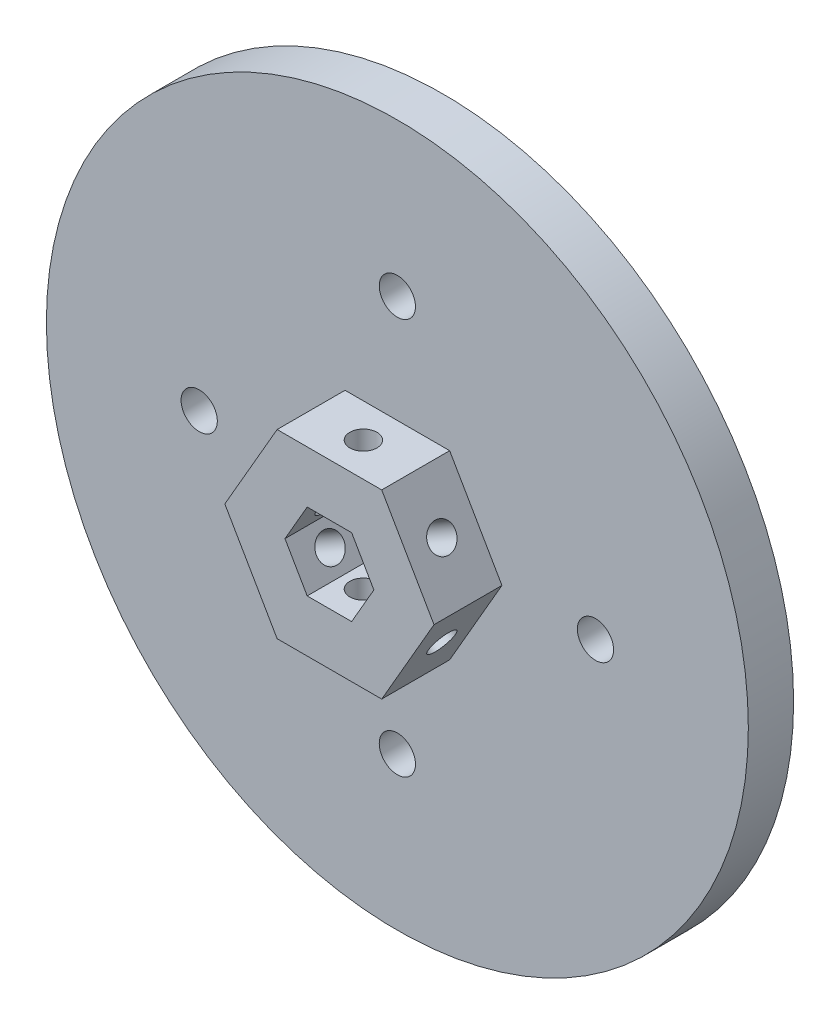
ISO-10303-21;
HEADER;
FILE_DESCRIPTION(('STEP AP214'),'2;1');
FILE_NAME('part.step','',(''),(''),'','','');
FILE_SCHEMA(('AUTOMOTIVE_DESIGN { 1 0 10303 214 1 1 1 1 }'));
ENDSEC;
DATA;
#1=APPLICATION_CONTEXT('core data for automotive mechanical design processes');
#2=APPLICATION_PROTOCOL_DEFINITION('international standard','automotive_design',2000,#1);
#3=PRODUCT_CONTEXT('',#1,'mechanical');
#4=PRODUCT('Part','Part','',(#3));
#5=PRODUCT_RELATED_PRODUCT_CATEGORY('part','',(#4));
#6=PRODUCT_DEFINITION_FORMATION('','',#4);
#7=PRODUCT_DEFINITION_CONTEXT('part definition',#1,'design');
#8=PRODUCT_DEFINITION('design','',#6,#7);
#9=PRODUCT_DEFINITION_SHAPE('','',#8);
#10=(LENGTH_UNIT() NAMED_UNIT(*) SI_UNIT(.MILLI.,.METRE.));
#11=(NAMED_UNIT(*) PLANE_ANGLE_UNIT() SI_UNIT($,.RADIAN.));
#12=(NAMED_UNIT(*) SI_UNIT($,.STERADIAN.) SOLID_ANGLE_UNIT());
#13=UNCERTAINTY_MEASURE_WITH_UNIT(LENGTH_MEASURE(1.E-05),#10,'distance_accuracy_value','');
#14=(GEOMETRIC_REPRESENTATION_CONTEXT(3) GLOBAL_UNCERTAINTY_ASSIGNED_CONTEXT((#13)) GLOBAL_UNIT_ASSIGNED_CONTEXT((#10,
#11,#12)) REPRESENTATION_CONTEXT('',''));
#15=CARTESIAN_POINT('',(0.,0.,0.));
#16=DIRECTION('',(0.,0.,1.));
#17=DIRECTION('',(1.,0.,0.));
#18=AXIS2_PLACEMENT_3D('',#15,#16,#17);
#19=CARTESIAN_POINT('',(0.,0.,4.));
#20=DIRECTION('',(0.,0.,1.));
#21=DIRECTION('',(1.,0.,0.));
#22=AXIS2_PLACEMENT_3D('',#19,#20,#21);
#23=PLANE('',#22);
#24=CARTESIAN_POINT('',(-17.5,0.,4.));
#25=DIRECTION('',(0.,0.,1.));
#26=DIRECTION('',(-1.,0.,0.));
#27=AXIS2_PLACEMENT_3D('',#24,#25,#26);
#28=CIRCLE('',#27,1.6);
#29=CARTESIAN_POINT('',(-19.1,0.,4.));
#30=VERTEX_POINT('',#29);
#31=EDGE_CURVE('E157',#30,#30,#28,.T.);
#32=ORIENTED_EDGE('',*,*,#31,.F.);
#33=EDGE_LOOP('',(#32));
#34=FACE_BOUND('',#33,.T.);
#35=CARTESIAN_POINT('',(0.,-17.5,4.));
#36=DIRECTION('',(0.,0.,1.));
#37=DIRECTION('',(-1.,0.,0.));
#38=AXIS2_PLACEMENT_3D('',#35,#36,#37);
#39=CIRCLE('',#38,1.6);
#40=CARTESIAN_POINT('',(-1.6,-17.5,4.));
#41=VERTEX_POINT('',#40);
#42=EDGE_CURVE('E160',#41,#41,#39,.T.);
#43=ORIENTED_EDGE('',*,*,#42,.F.);
#44=EDGE_LOOP('',(#43));
#45=FACE_BOUND('',#44,.T.);
#46=CARTESIAN_POINT('',(17.5,0.,4.));
#47=DIRECTION('',(0.,0.,1.));
#48=DIRECTION('',(1.,0.,0.));
#49=AXIS2_PLACEMENT_3D('',#46,#47,#48);
#50=CIRCLE('',#49,1.6);
#51=CARTESIAN_POINT('',(19.1,0.,4.));
#52=VERTEX_POINT('',#51);
#53=EDGE_CURVE('E164',#52,#52,#50,.T.);
#54=ORIENTED_EDGE('',*,*,#53,.F.);
#55=EDGE_LOOP('',(#54));
#56=FACE_BOUND('',#55,.T.);
#57=CARTESIAN_POINT('',(0.,17.5,4.));
#58=DIRECTION('',(0.,0.,1.));
#59=DIRECTION('',(1.,0.,0.));
#60=AXIS2_PLACEMENT_3D('',#57,#58,#59);
#61=CIRCLE('',#60,1.6);
#62=CARTESIAN_POINT('',(1.6,17.5,4.));
#63=VERTEX_POINT('',#62);
#64=EDGE_CURVE('E168',#63,#63,#61,.T.);
#65=ORIENTED_EDGE('',*,*,#64,.F.);
#66=EDGE_LOOP('',(#65));
#67=FACE_BOUND('',#66,.T.);
#68=CARTESIAN_POINT('',(0.,0.,4.));
#69=DIRECTION('',(0.,0.,1.));
#70=DIRECTION('',(1.,0.,0.));
#71=AXIS2_PLACEMENT_3D('',#68,#69,#70);
#72=CIRCLE('',#71,31.);
#73=CARTESIAN_POINT('',(31.,0.,4.));
#74=VERTEX_POINT('',#73);
#75=EDGE_CURVE('E11',#74,#74,#72,.T.);
#76=ORIENTED_EDGE('',*,*,#75,.T.);
#77=EDGE_LOOP('',(#76));
#78=FACE_BOUND('',#77,.T.);
#79=DIRECTION('',(-1.,0.,0.));
#80=VECTOR('',#79,1.);
#81=CARTESIAN_POINT('',(4.618802153517,8.,4.));
#82=LINE('',#81,#80);
#83=CARTESIAN_POINT('',(4.618802153517,8.,4.));
#84=VERTEX_POINT('',#83);
#85=CARTESIAN_POINT('',(-4.61880215351701,8.,4.));
#86=VERTEX_POINT('',#85);
#87=EDGE_CURVE('E235',#84,#86,#82,.T.);
#88=ORIENTED_EDGE('',*,*,#87,.F.);
#89=DIRECTION('',(-0.5,0.866025403784439,0.));
#90=VECTOR('',#89,1.);
#91=CARTESIAN_POINT('',(9.23760430703401,0.,4.));
#92=LINE('',#91,#90);
#93=CARTESIAN_POINT('',(9.23760430703401,0.,4.));
#94=VERTEX_POINT('',#93);
#95=EDGE_CURVE('E217',#94,#84,#92,.T.);
#96=ORIENTED_EDGE('',*,*,#95,.F.);
#97=DIRECTION('',(0.5,0.866025403784439,0.));
#98=VECTOR('',#97,1.);
#99=CARTESIAN_POINT('',(4.618802153517,-8.,4.));
#100=LINE('',#99,#98);
#101=CARTESIAN_POINT('',(4.618802153517,-8.,4.));
#102=VERTEX_POINT('',#101);
#103=EDGE_CURVE('E222',#102,#94,#100,.T.);
#104=ORIENTED_EDGE('',*,*,#103,.F.);
#105=DIRECTION('',(1.,0.,0.));
#106=VECTOR('',#105,1.);
#107=CARTESIAN_POINT('',(-4.61880215351701,-8.,4.));
#108=LINE('',#107,#106);
#109=CARTESIAN_POINT('',(-4.61880215351701,-8.,4.));
#110=VERTEX_POINT('',#109);
#111=EDGE_CURVE('E241',#110,#102,#108,.T.);
#112=ORIENTED_EDGE('',*,*,#111,.F.);
#113=DIRECTION('',(0.5,-0.866025403784439,0.));
#114=VECTOR('',#113,1.);
#115=CARTESIAN_POINT('',(-9.23760430703401,0.,4.));
#116=LINE('',#115,#114);
#117=CARTESIAN_POINT('',(-9.23760430703401,0.,4.));
#118=VERTEX_POINT('',#117);
#119=EDGE_CURVE('E239',#118,#110,#116,.T.);
#120=ORIENTED_EDGE('',*,*,#119,.F.);
#121=DIRECTION('',(-0.5,-0.866025403784439,0.));
#122=VECTOR('',#121,1.);
#123=CARTESIAN_POINT('',(-4.61880215351701,8.,4.));
#124=LINE('',#123,#122);
#125=EDGE_CURVE('E237',#86,#118,#124,.T.);
#126=ORIENTED_EDGE('',*,*,#125,.F.);
#127=EDGE_LOOP('',(#88,#96,#104,#112,#120,#126));
#128=FACE_BOUND('',#127,.T.);
#129=ADVANCED_FACE('F33',(#34,#45,#56,#67,#78,#128),#23,.T.);
#130=CARTESIAN_POINT('',(0.,0.,4.));
#131=DIRECTION('',(0.,0.,-1.));
#132=DIRECTION('',(-1.,0.,0.));
#133=AXIS2_PLACEMENT_3D('',#130,#131,#132);
#134=CYLINDRICAL_SURFACE('',#133,31.);
#135=ORIENTED_EDGE('',*,*,#75,.F.);
#136=EDGE_LOOP('',(#135));
#137=FACE_BOUND('',#136,.T.);
#138=CARTESIAN_POINT('',(0.,0.,0.));
#139=DIRECTION('',(0.,0.,1.));
#140=DIRECTION('',(1.,0.,0.));
#141=AXIS2_PLACEMENT_3D('',#138,#139,#140);
#142=CIRCLE('',#141,31.);
#143=CARTESIAN_POINT('',(31.,0.,0.));
#144=VERTEX_POINT('',#143);
#145=EDGE_CURVE('E42',#144,#144,#142,.T.);
#146=ORIENTED_EDGE('',*,*,#145,.T.);
#147=EDGE_LOOP('',(#146));
#148=FACE_BOUND('',#147,.T.);
#149=ADVANCED_FACE('F35',(#137,#148),#134,.T.);
#150=CARTESIAN_POINT('',(0.,0.,0.));
#151=DIRECTION('',(0.,0.,1.));
#152=DIRECTION('',(1.,0.,0.));
#153=AXIS2_PLACEMENT_3D('',#150,#151,#152);
#154=PLANE('',#153);
#155=DIRECTION('',(1.,0.,0.));
#156=VECTOR('',#155,1.);
#157=CARTESIAN_POINT('',(-1.96299091524473,-3.4,0.));
#158=LINE('',#157,#156);
#159=CARTESIAN_POINT('',(-1.96299091524473,-3.4,0.));
#160=VERTEX_POINT('',#159);
#161=CARTESIAN_POINT('',(1.96299091524473,-3.4,0.));
#162=VERTEX_POINT('',#161);
#163=EDGE_CURVE('E147',#160,#162,#158,.T.);
#164=ORIENTED_EDGE('',*,*,#163,.T.);
#165=DIRECTION('',(0.5,0.866025403784438,0.));
#166=VECTOR('',#165,1.);
#167=CARTESIAN_POINT('',(1.96299091524473,-3.4,0.));
#168=LINE('',#167,#166);
#169=CARTESIAN_POINT('',(3.92598183048946,0.,0.));
#170=VERTEX_POINT('',#169);
#171=EDGE_CURVE('E129',#162,#170,#168,.T.);
#172=ORIENTED_EDGE('',*,*,#171,.T.);
#173=DIRECTION('',(-0.5,0.866025403784438,0.));
#174=VECTOR('',#173,1.);
#175=CARTESIAN_POINT('',(3.92598183048946,0.,0.));
#176=LINE('',#175,#174);
#177=CARTESIAN_POINT('',(1.96299091524473,3.4,0.));
#178=VERTEX_POINT('',#177);
#179=EDGE_CURVE('E137',#170,#178,#176,.T.);
#180=ORIENTED_EDGE('',*,*,#179,.T.);
#181=DIRECTION('',(-1.,0.,0.));
#182=VECTOR('',#181,1.);
#183=CARTESIAN_POINT('',(1.96299091524473,3.4,0.));
#184=LINE('',#183,#182);
#185=CARTESIAN_POINT('',(-1.96299091524473,3.4,0.));
#186=VERTEX_POINT('',#185);
#187=EDGE_CURVE('E141',#178,#186,#184,.T.);
#188=ORIENTED_EDGE('',*,*,#187,.T.);
#189=DIRECTION('',(-0.5,-0.866025403784439,0.));
#190=VECTOR('',#189,1.);
#191=CARTESIAN_POINT('',(-1.96299091524473,3.4,0.));
#192=LINE('',#191,#190);
#193=CARTESIAN_POINT('',(-3.92598183048946,0.,0.));
#194=VERTEX_POINT('',#193);
#195=EDGE_CURVE('E151',#186,#194,#192,.T.);
#196=ORIENTED_EDGE('',*,*,#195,.T.);
#197=DIRECTION('',(0.5,-0.866025403784438,0.));
#198=VECTOR('',#197,1.);
#199=CARTESIAN_POINT('',(-3.92598183048946,0.,0.));
#200=LINE('',#199,#198);
#201=EDGE_CURVE('E154',#194,#160,#200,.T.);
#202=ORIENTED_EDGE('',*,*,#201,.T.);
#203=EDGE_LOOP('',(#164,#172,#180,#188,#196,#202));
#204=FACE_BOUND('',#203,.T.);
#205=CARTESIAN_POINT('',(-17.5,0.,0.));
#206=DIRECTION('',(0.,0.,1.));
#207=DIRECTION('',(1.,0.,0.));
#208=AXIS2_PLACEMENT_3D('',#205,#206,#207);
#209=CIRCLE('',#208,1.6);
#210=CARTESIAN_POINT('',(-15.9,0.,0.));
#211=VERTEX_POINT('',#210);
#212=EDGE_CURVE('E37',#211,#211,#209,.T.);
#213=ORIENTED_EDGE('',*,*,#212,.T.);
#214=EDGE_LOOP('',(#213));
#215=FACE_BOUND('',#214,.T.);
#216=CARTESIAN_POINT('',(0.,-17.5,0.));
#217=DIRECTION('',(0.,0.,1.));
#218=DIRECTION('',(1.,0.,0.));
#219=AXIS2_PLACEMENT_3D('',#216,#217,#218);
#220=CIRCLE('',#219,1.6);
#221=CARTESIAN_POINT('',(1.6,-17.5,0.));
#222=VERTEX_POINT('',#221);
#223=EDGE_CURVE('E163',#222,#222,#220,.T.);
#224=ORIENTED_EDGE('',*,*,#223,.T.);
#225=EDGE_LOOP('',(#224));
#226=FACE_BOUND('',#225,.T.);
#227=CARTESIAN_POINT('',(17.5,0.,0.));
#228=DIRECTION('',(0.,0.,1.));
#229=DIRECTION('',(1.,0.,0.));
#230=AXIS2_PLACEMENT_3D('',#227,#228,#229);
#231=CIRCLE('',#230,1.6);
#232=CARTESIAN_POINT('',(19.1,0.,0.));
#233=VERTEX_POINT('',#232);
#234=EDGE_CURVE('E167',#233,#233,#231,.T.);
#235=ORIENTED_EDGE('',*,*,#234,.T.);
#236=EDGE_LOOP('',(#235));
#237=FACE_BOUND('',#236,.T.);
#238=CARTESIAN_POINT('',(0.,17.5,0.));
#239=DIRECTION('',(0.,0.,1.));
#240=DIRECTION('',(1.,0.,0.));
#241=AXIS2_PLACEMENT_3D('',#238,#239,#240);
#242=CIRCLE('',#241,1.6);
#243=CARTESIAN_POINT('',(1.6,17.5,0.));
#244=VERTEX_POINT('',#243);
#245=EDGE_CURVE('E171',#244,#244,#242,.T.);
#246=ORIENTED_EDGE('',*,*,#245,.T.);
#247=EDGE_LOOP('',(#246));
#248=FACE_BOUND('',#247,.T.);
#249=ORIENTED_EDGE('',*,*,#145,.F.);
#250=EDGE_LOOP('',(#249));
#251=FACE_BOUND('',#250,.T.);
#252=ADVANCED_FACE('F143',(#204,#215,#226,#237,#248,#251),#154,.F.);
#253=CARTESIAN_POINT('',(0.,0.,10.));
#254=DIRECTION('',(0.,0.,1.));
#255=DIRECTION('',(1.,0.,0.));
#256=AXIS2_PLACEMENT_3D('',#253,#254,#255);
#257=PLANE('',#256);
#258=DIRECTION('',(-0.5,0.866025403784439,0.));
#259=VECTOR('',#258,1.);
#260=CARTESIAN_POINT('',(9.23760430703401,0.,10.));
#261=LINE('',#260,#259);
#262=CARTESIAN_POINT('',(9.23760430703401,0.,10.));
#263=VERTEX_POINT('',#262);
#264=CARTESIAN_POINT('',(4.618802153517,8.,10.));
#265=VERTEX_POINT('',#264);
#266=EDGE_CURVE('E218',#263,#265,#261,.T.);
#267=ORIENTED_EDGE('',*,*,#266,.T.);
#268=DIRECTION('',(-1.,0.,0.));
#269=VECTOR('',#268,1.);
#270=CARTESIAN_POINT('',(4.618802153517,8.,10.));
#271=LINE('',#270,#269);
#272=CARTESIAN_POINT('',(-4.61880215351701,8.,10.));
#273=VERTEX_POINT('',#272);
#274=EDGE_CURVE('E221',#265,#273,#271,.T.);
#275=ORIENTED_EDGE('',*,*,#274,.T.);
#276=DIRECTION('',(-0.5,-0.866025403784439,0.));
#277=VECTOR('',#276,1.);
#278=CARTESIAN_POINT('',(-4.61880215351701,8.,10.));
#279=LINE('',#278,#277);
#280=CARTESIAN_POINT('',(-9.23760430703401,0.,10.));
#281=VERTEX_POINT('',#280);
#282=EDGE_CURVE('E224',#273,#281,#279,.T.);
#283=ORIENTED_EDGE('',*,*,#282,.T.);
#284=DIRECTION('',(0.5,-0.866025403784439,0.));
#285=VECTOR('',#284,1.);
#286=CARTESIAN_POINT('',(-9.23760430703401,0.,10.));
#287=LINE('',#286,#285);
#288=CARTESIAN_POINT('',(-4.61880215351701,-8.,10.));
#289=VERTEX_POINT('',#288);
#290=EDGE_CURVE('E226',#281,#289,#287,.T.);
#291=ORIENTED_EDGE('',*,*,#290,.T.);
#292=DIRECTION('',(1.,0.,0.));
#293=VECTOR('',#292,1.);
#294=CARTESIAN_POINT('',(-4.61880215351701,-8.,10.));
#295=LINE('',#294,#293);
#296=CARTESIAN_POINT('',(4.618802153517,-8.,10.));
#297=VERTEX_POINT('',#296);
#298=EDGE_CURVE('E228',#289,#297,#295,.T.);
#299=ORIENTED_EDGE('',*,*,#298,.T.);
#300=DIRECTION('',(0.5,0.866025403784439,0.));
#301=VECTOR('',#300,1.);
#302=CARTESIAN_POINT('',(4.618802153517,-8.,10.));
#303=LINE('',#302,#301);
#304=EDGE_CURVE('E230',#297,#263,#303,.T.);
#305=ORIENTED_EDGE('',*,*,#304,.T.);
#306=EDGE_LOOP('',(#267,#275,#283,#291,#299,#305));
#307=FACE_BOUND('',#306,.T.);
#308=DIRECTION('',(-1.,0.,0.));
#309=VECTOR('',#308,1.);
#310=CARTESIAN_POINT('',(1.96299091524473,3.4,10.));
#311=LINE('',#310,#309);
#312=CARTESIAN_POINT('',(1.96299091524473,3.4,10.));
#313=VERTEX_POINT('',#312);
#314=CARTESIAN_POINT('',(-1.96299091524473,3.4,10.));
#315=VERTEX_POINT('',#314);
#316=EDGE_CURVE('E199',#313,#315,#311,.T.);
#317=ORIENTED_EDGE('',*,*,#316,.F.);
#318=DIRECTION('',(-0.5,0.866025403784439,0.));
#319=VECTOR('',#318,1.);
#320=CARTESIAN_POINT('',(3.92598183048946,0.,10.));
#321=LINE('',#320,#319);
#322=CARTESIAN_POINT('',(3.92598183048946,0.,10.));
#323=VERTEX_POINT('',#322);
#324=EDGE_CURVE('E197',#323,#313,#321,.T.);
#325=ORIENTED_EDGE('',*,*,#324,.F.);
#326=DIRECTION('',(0.5,0.866025403784439,0.));
#327=VECTOR('',#326,1.);
#328=CARTESIAN_POINT('',(1.96299091524473,-3.4,10.));
#329=LINE('',#328,#327);
#330=CARTESIAN_POINT('',(1.96299091524473,-3.4,10.));
#331=VERTEX_POINT('',#330);
#332=EDGE_CURVE('E132',#331,#323,#329,.T.);
#333=ORIENTED_EDGE('',*,*,#332,.F.);
#334=DIRECTION('',(1.,0.,0.));
#335=VECTOR('',#334,1.);
#336=CARTESIAN_POINT('',(-1.96299091524473,-3.4,10.));
#337=LINE('',#336,#335);
#338=CARTESIAN_POINT('',(-1.96299091524473,-3.4,10.));
#339=VERTEX_POINT('',#338);
#340=EDGE_CURVE('E205',#339,#331,#337,.T.);
#341=ORIENTED_EDGE('',*,*,#340,.F.);
#342=DIRECTION('',(0.5,-0.866025403784438,0.));
#343=VECTOR('',#342,1.);
#344=CARTESIAN_POINT('',(-3.92598183048946,0.,10.));
#345=LINE('',#344,#343);
#346=CARTESIAN_POINT('',(-3.92598183048946,0.,10.));
#347=VERTEX_POINT('',#346);
#348=EDGE_CURVE('E203',#347,#339,#345,.T.);
#349=ORIENTED_EDGE('',*,*,#348,.F.);
#350=DIRECTION('',(-0.5,-0.866025403784439,0.));
#351=VECTOR('',#350,1.);
#352=CARTESIAN_POINT('',(-1.96299091524473,3.4,10.));
#353=LINE('',#352,#351);
#354=EDGE_CURVE('E201',#315,#347,#353,.T.);
#355=ORIENTED_EDGE('',*,*,#354,.F.);
#356=EDGE_LOOP('',(#317,#325,#333,#341,#349,#355));
#357=FACE_BOUND('',#356,.T.);
#358=ADVANCED_FACE('F307',(#307,#357),#257,.T.);
#359=CARTESIAN_POINT('',(9.23760430703401,0.,10.));
#360=DIRECTION('',(-0.866025403784438,-0.5,0.));
#361=DIRECTION('',(0.5,-0.866025403784439,0.));
#362=AXIS2_PLACEMENT_3D('',#359,#360,#361);
#363=PLANE('',#362);
#364=CARTESIAN_POINT('',(6.92820323027548,4.00000000000003,7.));
#365=DIRECTION('',(-0.866025403784438,-0.5,0.));
#366=DIRECTION('',(0.5,-0.866025403784439,0.));
#367=AXIS2_PLACEMENT_3D('',#364,#365,#366);
#368=CIRCLE('',#367,1.2);
#369=CARTESIAN_POINT('',(7.52820323027548,2.96076951545871,7.));
#370=VERTEX_POINT('',#369);
#371=EDGE_CURVE('E184',#370,#370,#368,.T.);
#372=ORIENTED_EDGE('',*,*,#371,.T.);
#373=EDGE_LOOP('',(#372));
#374=FACE_BOUND('',#373,.T.);
#375=ORIENTED_EDGE('',*,*,#95,.T.);
#376=DIRECTION('',(0.,0.,-1.));
#377=VECTOR('',#376,1.);
#378=CARTESIAN_POINT('',(4.618802153517,8.,10.));
#379=LINE('',#378,#377);
#380=EDGE_CURVE('E256',#265,#84,#379,.T.);
#381=ORIENTED_EDGE('',*,*,#380,.F.);
#382=ORIENTED_EDGE('',*,*,#266,.F.);
#383=DIRECTION('',(0.,0.,-1.));
#384=VECTOR('',#383,1.);
#385=CARTESIAN_POINT('',(9.23760430703401,0.,10.));
#386=LINE('',#385,#384);
#387=EDGE_CURVE('E232',#263,#94,#386,.T.);
#388=ORIENTED_EDGE('',*,*,#387,.T.);
#389=EDGE_LOOP('',(#375,#381,#382,#388));
#390=FACE_BOUND('',#389,.T.);
#391=ADVANCED_FACE('F304',(#374,#390),#363,.F.);
#392=CARTESIAN_POINT('',(4.618802153517,8.,10.));
#393=DIRECTION('',(0.,-1.,0.));
#394=DIRECTION('',(1.,0.,0.));
#395=AXIS2_PLACEMENT_3D('',#392,#393,#394);
#396=PLANE('',#395);
#397=CARTESIAN_POINT('',(0.,8.,7.));
#398=DIRECTION('',(0.,1.,0.));
#399=DIRECTION('',(-1.,0.,0.));
#400=AXIS2_PLACEMENT_3D('',#397,#398,#399);
#401=CIRCLE('',#400,1.2);
#402=CARTESIAN_POINT('',(-1.2,8.,7.));
#403=VERTEX_POINT('',#402);
#404=EDGE_CURVE('E187',#403,#403,#401,.T.);
#405=ORIENTED_EDGE('',*,*,#404,.F.);
#406=EDGE_LOOP('',(#405));
#407=FACE_BOUND('',#406,.T.);
#408=ORIENTED_EDGE('',*,*,#87,.T.);
#409=DIRECTION('',(0.,0.,-1.));
#410=VECTOR('',#409,1.);
#411=CARTESIAN_POINT('',(-4.61880215351701,8.,10.));
#412=LINE('',#411,#410);
#413=EDGE_CURVE('E253',#273,#86,#412,.T.);
#414=ORIENTED_EDGE('',*,*,#413,.F.);
#415=ORIENTED_EDGE('',*,*,#274,.F.);
#416=ORIENTED_EDGE('',*,*,#380,.T.);
#417=EDGE_LOOP('',(#408,#414,#415,#416));
#418=FACE_BOUND('',#417,.T.);
#419=ADVANCED_FACE('F316',(#407,#418),#396,.F.);
#420=CARTESIAN_POINT('',(-4.61880215351701,8.,10.));
#421=DIRECTION('',(0.866025403784439,-0.5,0.));
#422=DIRECTION('',(0.5,0.866025403784439,0.));
#423=AXIS2_PLACEMENT_3D('',#420,#421,#422);
#424=PLANE('',#423);
#425=CARTESIAN_POINT('',(-6.92820323027555,3.99999999999993,7.));
#426=DIRECTION('',(0.866025403784439,-0.5,0.));
#427=DIRECTION('',(0.5,0.866025403784439,0.));
#428=AXIS2_PLACEMENT_3D('',#425,#426,#427);
#429=CIRCLE('',#428,1.2);
#430=CARTESIAN_POINT('',(-6.32820323027555,5.03923048454126,7.));
#431=VERTEX_POINT('',#430);
#432=EDGE_CURVE('E179',#431,#431,#429,.T.);
#433=ORIENTED_EDGE('',*,*,#432,.T.);
#434=EDGE_LOOP('',(#433));
#435=FACE_BOUND('',#434,.T.);
#436=ORIENTED_EDGE('',*,*,#125,.T.);
#437=DIRECTION('',(0.,0.,-1.));
#438=VECTOR('',#437,1.);
#439=CARTESIAN_POINT('',(-9.23760430703401,0.,10.));
#440=LINE('',#439,#438);
#441=EDGE_CURVE('E250',#281,#118,#440,.T.);
#442=ORIENTED_EDGE('',*,*,#441,.F.);
#443=ORIENTED_EDGE('',*,*,#282,.F.);
#444=ORIENTED_EDGE('',*,*,#413,.T.);
#445=EDGE_LOOP('',(#436,#442,#443,#444));
#446=FACE_BOUND('',#445,.T.);
#447=ADVANCED_FACE('F333',(#435,#446),#424,.F.);
#448=CARTESIAN_POINT('',(-9.23760430703401,0.,10.));
#449=DIRECTION('',(0.866025403784438,0.5,0.));
#450=DIRECTION('',(-0.5,0.866025403784439,0.));
#451=AXIS2_PLACEMENT_3D('',#448,#449,#450);
#452=PLANE('',#451);
#453=CARTESIAN_POINT('',(-6.92820323027549,-4.00000000000003,7.));
#454=DIRECTION('',(-0.866025403784436,-0.500000000000004,0.));
#455=DIRECTION('',(0.500000000000004,-0.866025403784436,0.));
#456=AXIS2_PLACEMENT_3D('',#453,#454,#455);
#457=CIRCLE('',#456,1.2);
#458=CARTESIAN_POINT('',(-6.32820323027548,-5.03923048454136,7.));
#459=VERTEX_POINT('',#458);
#460=EDGE_CURVE('E175',#459,#459,#457,.T.);
#461=ORIENTED_EDGE('',*,*,#460,.F.);
#462=EDGE_LOOP('',(#461));
#463=FACE_BOUND('',#462,.T.);
#464=ORIENTED_EDGE('',*,*,#119,.T.);
#465=DIRECTION('',(0.,0.,-1.));
#466=VECTOR('',#465,1.);
#467=CARTESIAN_POINT('',(-4.61880215351701,-8.,10.));
#468=LINE('',#467,#466);
#469=EDGE_CURVE('E247',#289,#110,#468,.T.);
#470=ORIENTED_EDGE('',*,*,#469,.F.);
#471=ORIENTED_EDGE('',*,*,#290,.F.);
#472=ORIENTED_EDGE('',*,*,#441,.T.);
#473=EDGE_LOOP('',(#464,#470,#471,#472));
#474=FACE_BOUND('',#473,.T.);
#475=ADVANCED_FACE('F329',(#463,#474),#452,.F.);
#476=CARTESIAN_POINT('',(-4.61880215351701,-8.,10.));
#477=DIRECTION('',(0.,1.,0.));
#478=DIRECTION('',(-1.,0.,0.));
#479=AXIS2_PLACEMENT_3D('',#476,#477,#478);
#480=PLANE('',#479);
#481=CARTESIAN_POINT('',(0.,-8.,7.));
#482=DIRECTION('',(0.,1.,0.));
#483=DIRECTION('',(-1.,0.,0.));
#484=AXIS2_PLACEMENT_3D('',#481,#482,#483);
#485=CIRCLE('',#484,1.2);
#486=CARTESIAN_POINT('',(-1.2,-8.,7.));
#487=VERTEX_POINT('',#486);
#488=EDGE_CURVE('E194',#487,#487,#485,.T.);
#489=ORIENTED_EDGE('',*,*,#488,.T.);
#490=EDGE_LOOP('',(#489));
#491=FACE_BOUND('',#490,.T.);
#492=ORIENTED_EDGE('',*,*,#111,.T.);
#493=DIRECTION('',(0.,0.,-1.));
#494=VECTOR('',#493,1.);
#495=CARTESIAN_POINT('',(4.618802153517,-8.,10.));
#496=LINE('',#495,#494);
#497=EDGE_CURVE('E58',#297,#102,#496,.T.);
#498=ORIENTED_EDGE('',*,*,#497,.F.);
#499=ORIENTED_EDGE('',*,*,#298,.F.);
#500=ORIENTED_EDGE('',*,*,#469,.T.);
#501=EDGE_LOOP('',(#492,#498,#499,#500));
#502=FACE_BOUND('',#501,.T.);
#503=ADVANCED_FACE('F325',(#491,#502),#480,.F.);
#504=CARTESIAN_POINT('',(4.618802153517,-8.,10.));
#505=DIRECTION('',(-0.866025403784439,0.5,0.));
#506=DIRECTION('',(-0.5,-0.866025403784439,0.));
#507=AXIS2_PLACEMENT_3D('',#504,#505,#506);
#508=PLANE('',#507);
#509=CARTESIAN_POINT('',(6.92820323027555,-3.99999999999993,7.));
#510=DIRECTION('',(0.866025403784443,-0.499999999999992,0.));
#511=DIRECTION('',(0.499999999999992,0.866025403784443,0.));
#512=AXIS2_PLACEMENT_3D('',#509,#510,#511);
#513=CIRCLE('',#512,1.2);
#514=CARTESIAN_POINT('',(7.52820323027554,-2.9607695154586,7.));
#515=VERTEX_POINT('',#514);
#516=EDGE_CURVE('E172',#515,#515,#513,.T.);
#517=ORIENTED_EDGE('',*,*,#516,.F.);
#518=EDGE_LOOP('',(#517));
#519=FACE_BOUND('',#518,.T.);
#520=ORIENTED_EDGE('',*,*,#103,.T.);
#521=ORIENTED_EDGE('',*,*,#387,.F.);
#522=ORIENTED_EDGE('',*,*,#304,.F.);
#523=ORIENTED_EDGE('',*,*,#497,.T.);
#524=EDGE_LOOP('',(#520,#521,#522,#523));
#525=FACE_BOUND('',#524,.T.);
#526=ADVANCED_FACE('F322',(#519,#525),#508,.F.);
#527=CARTESIAN_POINT('',(3.92598183048946,0.,10.));
#528=DIRECTION('',(-0.866025403784438,-0.5,0.));
#529=DIRECTION('',(0.5,-0.866025403784439,0.));
#530=AXIS2_PLACEMENT_3D('',#527,#528,#529);
#531=PLANE('',#530);
#532=CARTESIAN_POINT('',(2.94448637286708,1.70000000000001,7.));
#533=DIRECTION('',(-0.866025403784438,-0.5,0.));
#534=DIRECTION('',(0.5,-0.866025403784439,0.));
#535=AXIS2_PLACEMENT_3D('',#532,#533,#534);
#536=CIRCLE('',#535,1.2);
#537=CARTESIAN_POINT('',(3.54448637286708,0.660769515458688,7.));
#538=VERTEX_POINT('',#537);
#539=EDGE_CURVE('E182',#538,#538,#536,.T.);
#540=ORIENTED_EDGE('',*,*,#539,.F.);
#541=EDGE_LOOP('',(#540));
#542=FACE_BOUND('',#541,.T.);
#543=DIRECTION('',(0.,0.,-1.));
#544=VECTOR('',#543,1.);
#545=CARTESIAN_POINT('',(1.96299091524473,3.4,10.));
#546=LINE('',#545,#544);
#547=EDGE_CURVE('E50',#313,#178,#546,.T.);
#548=ORIENTED_EDGE('',*,*,#547,.T.);
#549=ORIENTED_EDGE('',*,*,#179,.F.);
#550=DIRECTION('',(0.,0.,-1.));
#551=VECTOR('',#550,1.);
#552=CARTESIAN_POINT('',(3.92598183048946,0.,10.));
#553=LINE('',#552,#551);
#554=EDGE_CURVE('E126',#323,#170,#553,.T.);
#555=ORIENTED_EDGE('',*,*,#554,.F.);
#556=ORIENTED_EDGE('',*,*,#324,.T.);
#557=EDGE_LOOP('',(#548,#549,#555,#556));
#558=FACE_BOUND('',#557,.T.);
#559=ADVANCED_FACE('F138',(#542,#558),#531,.T.);
#560=CARTESIAN_POINT('',(1.96299091524473,3.4,10.));
#561=DIRECTION('',(0.,-1.,0.));
#562=DIRECTION('',(1.,0.,0.));
#563=AXIS2_PLACEMENT_3D('',#560,#561,#562);
#564=PLANE('',#563);
#565=CARTESIAN_POINT('',(0.,3.4,7.));
#566=DIRECTION('',(0.,-1.,0.));
#567=DIRECTION('',(1.,0.,0.));
#568=AXIS2_PLACEMENT_3D('',#565,#566,#567);
#569=CIRCLE('',#568,1.2);
#570=CARTESIAN_POINT('',(1.2,3.4,7.));
#571=VERTEX_POINT('',#570);
#572=EDGE_CURVE('E191',#571,#571,#569,.T.);
#573=ORIENTED_EDGE('',*,*,#572,.F.);
#574=EDGE_LOOP('',(#573));
#575=FACE_BOUND('',#574,.T.);
#576=DIRECTION('',(0.,0.,-1.));
#577=VECTOR('',#576,1.);
#578=CARTESIAN_POINT('',(-1.96299091524473,3.4,10.));
#579=LINE('',#578,#577);
#580=EDGE_CURVE('E214',#315,#186,#579,.T.);
#581=ORIENTED_EDGE('',*,*,#580,.T.);
#582=ORIENTED_EDGE('',*,*,#187,.F.);
#583=ORIENTED_EDGE('',*,*,#547,.F.);
#584=ORIENTED_EDGE('',*,*,#316,.T.);
#585=EDGE_LOOP('',(#581,#582,#583,#584));
#586=FACE_BOUND('',#585,.T.);
#587=ADVANCED_FACE('F395',(#575,#586),#564,.T.);
#588=CARTESIAN_POINT('',(-1.96299091524473,3.4,10.));
#589=DIRECTION('',(0.866025403784439,-0.5,0.));
#590=DIRECTION('',(0.5,0.866025403784439,0.));
#591=AXIS2_PLACEMENT_3D('',#588,#589,#590);
#592=PLANE('',#591);
#593=CARTESIAN_POINT('',(-2.9444863728671,1.69999999999997,7.));
#594=DIRECTION('',(0.866025403784439,-0.5,0.));
#595=DIRECTION('',(0.5,0.866025403784439,0.));
#596=AXIS2_PLACEMENT_3D('',#593,#594,#595);
#597=CIRCLE('',#596,1.2);
#598=CARTESIAN_POINT('',(-2.3444863728671,2.7392304845413,7.));
#599=VERTEX_POINT('',#598);
#600=EDGE_CURVE('E183',#599,#599,#597,.T.);
#601=ORIENTED_EDGE('',*,*,#600,.F.);
#602=EDGE_LOOP('',(#601));
#603=FACE_BOUND('',#602,.T.);
#604=DIRECTION('',(0.,0.,-1.));
#605=VECTOR('',#604,1.);
#606=CARTESIAN_POINT('',(-3.92598183048946,0.,10.));
#607=LINE('',#606,#605);
#608=EDGE_CURVE('E212',#347,#194,#607,.T.);
#609=ORIENTED_EDGE('',*,*,#608,.T.);
#610=ORIENTED_EDGE('',*,*,#195,.F.);
#611=ORIENTED_EDGE('',*,*,#580,.F.);
#612=ORIENTED_EDGE('',*,*,#354,.T.);
#613=EDGE_LOOP('',(#609,#610,#611,#612));
#614=FACE_BOUND('',#613,.T.);
#615=ADVANCED_FACE('F392',(#603,#614),#592,.T.);
#616=CARTESIAN_POINT('',(-3.92598183048946,0.,10.));
#617=DIRECTION('',(0.866025403784439,0.5,0.));
#618=DIRECTION('',(-0.5,0.866025403784439,0.));
#619=AXIS2_PLACEMENT_3D('',#616,#617,#618);
#620=PLANE('',#619);
#621=CARTESIAN_POINT('',(-2.94448637286709,-1.70000000000002,7.));
#622=DIRECTION('',(0.866025403784439,0.5,0.));
#623=DIRECTION('',(-0.5,0.866025403784439,0.));
#624=AXIS2_PLACEMENT_3D('',#621,#622,#623);
#625=CIRCLE('',#624,1.2);
#626=CARTESIAN_POINT('',(-3.54448637286709,-0.660769515458691,7.));
#627=VERTEX_POINT('',#626);
#628=EDGE_CURVE('E264',#627,#627,#625,.T.);
#629=ORIENTED_EDGE('',*,*,#628,.F.);
#630=EDGE_LOOP('',(#629));
#631=FACE_BOUND('',#630,.T.);
#632=DIRECTION('',(0.,0.,-1.));
#633=VECTOR('',#632,1.);
#634=CARTESIAN_POINT('',(-1.96299091524473,-3.4,10.));
#635=LINE('',#634,#633);
#636=EDGE_CURVE('E210',#339,#160,#635,.T.);
#637=ORIENTED_EDGE('',*,*,#636,.T.);
#638=ORIENTED_EDGE('',*,*,#201,.F.);
#639=ORIENTED_EDGE('',*,*,#608,.F.);
#640=ORIENTED_EDGE('',*,*,#348,.T.);
#641=EDGE_LOOP('',(#637,#638,#639,#640));
#642=FACE_BOUND('',#641,.T.);
#643=ADVANCED_FACE('F388',(#631,#642),#620,.T.);
#644=CARTESIAN_POINT('',(-1.96299091524473,-3.4,10.));
#645=DIRECTION('',(0.,1.,0.));
#646=DIRECTION('',(0.,0.,1.));
#647=AXIS2_PLACEMENT_3D('',#644,#645,#646);
#648=PLANE('',#647);
#649=CARTESIAN_POINT('',(0.,-3.4,7.));
#650=DIRECTION('',(0.,1.,0.));
#651=DIRECTION('',(0.,0.,1.));
#652=AXIS2_PLACEMENT_3D('',#649,#650,#651);
#653=CIRCLE('',#652,1.2);
#654=CARTESIAN_POINT('',(0.,-3.4,8.2));
#655=VERTEX_POINT('',#654);
#656=EDGE_CURVE('E190',#655,#655,#653,.T.);
#657=ORIENTED_EDGE('',*,*,#656,.F.);
#658=EDGE_LOOP('',(#657));
#659=FACE_BOUND('',#658,.T.);
#660=DIRECTION('',(0.,0.,-1.));
#661=VECTOR('',#660,1.);
#662=CARTESIAN_POINT('',(1.96299091524473,-3.4,10.));
#663=LINE('',#662,#661);
#664=EDGE_CURVE('E134',#331,#162,#663,.T.);
#665=ORIENTED_EDGE('',*,*,#664,.T.);
#666=ORIENTED_EDGE('',*,*,#163,.F.);
#667=ORIENTED_EDGE('',*,*,#636,.F.);
#668=ORIENTED_EDGE('',*,*,#340,.T.);
#669=EDGE_LOOP('',(#665,#666,#667,#668));
#670=FACE_BOUND('',#669,.T.);
#671=ADVANCED_FACE('F384',(#659,#670),#648,.T.);
#672=CARTESIAN_POINT('',(1.96299091524473,-3.4,10.));
#673=DIRECTION('',(-0.866025403784438,0.5,0.));
#674=DIRECTION('',(-0.5,-0.866025403784439,0.));
#675=AXIS2_PLACEMENT_3D('',#672,#673,#674);
#676=PLANE('',#675);
#677=CARTESIAN_POINT('',(2.9444863728671,-1.69999999999997,7.));
#678=DIRECTION('',(-0.866025403784438,0.5,0.));
#679=DIRECTION('',(-0.5,-0.866025403784439,0.));
#680=AXIS2_PLACEMENT_3D('',#677,#678,#679);
#681=CIRCLE('',#680,1.2);
#682=CARTESIAN_POINT('',(3.5444863728671,-0.660769515458643,7.));
#683=VERTEX_POINT('',#682);
#684=EDGE_CURVE('E178',#683,#683,#681,.T.);
#685=ORIENTED_EDGE('',*,*,#684,.F.);
#686=EDGE_LOOP('',(#685));
#687=FACE_BOUND('',#686,.T.);
#688=ORIENTED_EDGE('',*,*,#554,.T.);
#689=ORIENTED_EDGE('',*,*,#171,.F.);
#690=ORIENTED_EDGE('',*,*,#664,.F.);
#691=ORIENTED_EDGE('',*,*,#332,.T.);
#692=EDGE_LOOP('',(#688,#689,#690,#691));
#693=FACE_BOUND('',#692,.T.);
#694=ADVANCED_FACE('F127',(#687,#693),#676,.T.);
#695=CARTESIAN_POINT('',(0.,-31.,7.));
#696=DIRECTION('',(0.,1.,0.));
#697=DIRECTION('',(-1.,0.,0.));
#698=AXIS2_PLACEMENT_3D('',#695,#696,#697);
#699=CYLINDRICAL_SURFACE('',#698,1.2);
#700=ORIENTED_EDGE('',*,*,#656,.T.);
#701=EDGE_LOOP('',(#700));
#702=FACE_BOUND('',#701,.T.);
#703=ORIENTED_EDGE('',*,*,#488,.F.);
#704=EDGE_LOOP('',(#703));
#705=FACE_BOUND('',#704,.T.);
#706=ADVANCED_FACE('F367',(#702,#705),#699,.F.);
#707=ORIENTED_EDGE('',*,*,#572,.T.);
#708=EDGE_LOOP('',(#707));
#709=FACE_BOUND('',#708,.T.);
#710=ORIENTED_EDGE('',*,*,#404,.T.);
#711=EDGE_LOOP('',(#710));
#712=FACE_BOUND('',#711,.T.);
#713=ADVANCED_FACE('F364',(#709,#712),#699,.F.);
#714=CARTESIAN_POINT('',(-36.6733937586589,21.1733937586584,7.));
#715=DIRECTION('',(0.866025403784443,-0.499999999999992,0.));
#716=DIRECTION('',(0.499999999999992,0.866025403784444,0.));
#717=AXIS2_PLACEMENT_3D('',#714,#715,#716);
#718=CYLINDRICAL_SURFACE('',#717,1.2);
#719=CARTESIAN_POINT('',(3.5444863728671,-0.660769515458643,7.));
#720=CARTESIAN_POINT('',(3.58598342346511,-0.684727848791974,7.));
#721=CARTESIAN_POINT('',(3.62748047406311,-0.708686182125306,7.));
#722=CARTESIAN_POINT('',(3.71047457525912,-0.756602848791971,7.));
#723=CARTESIAN_POINT('',(3.75197162585712,-0.780561182125305,7.));
#724=CARTESIAN_POINT('',(3.83496572705314,-0.828477848791972,7.));
#725=CARTESIAN_POINT('',(3.87646277765114,-0.852436182125306,7.));
#726=CARTESIAN_POINT('',(3.95945687884715,-0.900352848791972,7.));
#727=CARTESIAN_POINT('',(4.00095392944516,-0.924311182125304,7.));
#728=CARTESIAN_POINT('',(4.08394803064117,-0.972227848791968,7.));
#729=CARTESIAN_POINT('',(4.12544508123917,-0.996186182125301,7.));
#730=CARTESIAN_POINT('',(4.20843918243518,-1.04410284879197,7.));
#731=CARTESIAN_POINT('',(4.24993623303318,-1.0680611821253,7.));
#732=CARTESIAN_POINT('',(4.33293033422919,-1.11597784879197,7.));
#733=CARTESIAN_POINT('',(4.37442738482719,-1.1399361821253,7.));
#734=CARTESIAN_POINT('',(4.4574214860232,-1.18785284879197,7.));
#735=CARTESIAN_POINT('',(4.49891853662121,-1.2118111821253,7.));
#736=CARTESIAN_POINT('',(4.58191263781721,-1.25972784879196,7.));
#737=CARTESIAN_POINT('',(4.62340968841522,-1.2836861821253,7.));
#738=CARTESIAN_POINT('',(4.70640378961123,-1.33160284879196,7.));
#739=CARTESIAN_POINT('',(4.74790084020923,-1.35556118212529,7.));
#740=CARTESIAN_POINT('',(4.83089494140524,-1.40347784879196,7.));
#741=CARTESIAN_POINT('',(4.87239199200325,-1.42743618212529,7.));
#742=CARTESIAN_POINT('',(4.95538609319926,-1.47535284879196,7.));
#743=CARTESIAN_POINT('',(4.99688314379726,-1.4993111821253,7.));
#744=CARTESIAN_POINT('',(5.07987724499327,-1.54722784879196,7.));
#745=CARTESIAN_POINT('',(5.12137429559127,-1.57118618212529,7.));
#746=CARTESIAN_POINT('',(5.20436839678728,-1.61910284879196,7.));
#747=CARTESIAN_POINT('',(5.24586544738529,-1.64306118212529,7.));
#748=CARTESIAN_POINT('',(5.3288595485813,-1.69097784879196,7.));
#749=CARTESIAN_POINT('',(5.37035659917931,-1.71493618212529,7.));
#750=CARTESIAN_POINT('',(5.45335070037531,-1.76285284879195,7.));
#751=CARTESIAN_POINT('',(5.49484775097332,-1.78681118212529,7.));
#752=CARTESIAN_POINT('',(5.57784185216933,-1.83472784879195,7.));
#753=CARTESIAN_POINT('',(5.61933890276733,-1.85868618212529,7.));
#754=CARTESIAN_POINT('',(5.70233300396334,-1.90660284879195,7.));
#755=CARTESIAN_POINT('',(5.74383005456134,-1.93056118212528,7.));
#756=CARTESIAN_POINT('',(5.82682415575735,-1.97847784879195,7.));
#757=CARTESIAN_POINT('',(5.86832120635536,-2.00243618212528,7.));
#758=CARTESIAN_POINT('',(5.95131530755137,-2.05035284879195,7.));
#759=CARTESIAN_POINT('',(5.99281235814937,-2.07431118212528,7.));
#760=CARTESIAN_POINT('',(6.07580645934538,-2.12222784879195,7.));
#761=CARTESIAN_POINT('',(6.11730350994339,-2.14618618212528,7.));
#762=CARTESIAN_POINT('',(6.2002976111394,-2.19410284879195,7.));
#763=CARTESIAN_POINT('',(6.2417946617374,-2.21806118212528,7.));
#764=CARTESIAN_POINT('',(6.32478876293341,-2.26597784879195,7.));
#765=CARTESIAN_POINT('',(6.36628581353141,-2.28993618212528,7.));
#766=CARTESIAN_POINT('',(6.44927991472742,-2.33785284879195,7.));
#767=CARTESIAN_POINT('',(6.49077696532542,-2.36181118212528,7.));
#768=CARTESIAN_POINT('',(6.57377106652143,-2.40972784879194,7.));
#769=CARTESIAN_POINT('',(6.61526811711944,-2.43368618212528,7.));
#770=CARTESIAN_POINT('',(6.69826221831544,-2.48160284879194,7.));
#771=CARTESIAN_POINT('',(6.73975926891345,-2.50556118212528,7.));
#772=CARTESIAN_POINT('',(6.82275337010946,-2.55347784879194,7.));
#773=CARTESIAN_POINT('',(6.86425042070746,-2.57743618212527,7.));
#774=CARTESIAN_POINT('',(6.94724452190348,-2.62535284879194,7.));
#775=CARTESIAN_POINT('',(6.98874157250148,-2.64931118212527,7.));
#776=CARTESIAN_POINT('',(7.07173567369749,-2.69722784879194,7.));
#777=CARTESIAN_POINT('',(7.11323272429549,-2.72118618212527,7.));
#778=CARTESIAN_POINT('',(7.1962268254915,-2.76910284879194,7.));
#779=CARTESIAN_POINT('',(7.23772387608951,-2.79306118212527,7.));
#780=CARTESIAN_POINT('',(7.32071797728552,-2.84097784879194,7.));
#781=CARTESIAN_POINT('',(7.36221502788352,-2.86493618212527,7.));
#782=CARTESIAN_POINT('',(7.44520912907953,-2.91285284879194,7.));
#783=CARTESIAN_POINT('',(7.48670617967753,-2.93681118212527,7.));
#784=CARTESIAN_POINT('',(7.52820323027554,-2.9607695154586,7.));
#785=B_SPLINE_CURVE_WITH_KNOTS('',3,(#719,#720,#721,#722,#723,#724,#725,#726,#727,#728,#729,
#730,#731,#732,#733,#734,#735,#736,#737,#738,#739,#740,#741,#742,#743,#744,#745,#746,#747,#748,
#749,#750,#751,#752,#753,#754,#755,#756,#757,#758,#759,#760,#761,#762,#763,#764,#765,#766,#767,
#768,#769,#770,#771,#772,#773,#774,#775,#776,#777,#778,#779,#780,#781,#782,#783,#784),
.UNSPECIFIED.,.F.,.F.,(4,2,2,2,2,2,2,2,2,2,2,2,2,2,2,2,2,2,2,2,2,2,2,2,2,2,2,2,2,2,2,2,4),(0.,
0.143749999999997,0.287499999999996,0.431250000000002,0.575,0.718749999999998,0.862499999999999,
1.00625,1.15,1.29374999999999,1.43749999999999,1.58125,1.725,1.86874999999999,2.0125,2.15625,
2.3,2.44375,2.58749999999999,2.73125,2.875,3.01875,3.1625,3.30625,3.44999999999999,
3.59374999999999,3.73749999999999,3.88124999999999,4.02499999999999,4.16874999999999,4.3125,
4.45625,4.6),.UNSPECIFIED.);
#786=EDGE_CURVE('BSEAM366',#683,#515,#785,.T.);
#787=ORIENTED_EDGE('',*,*,#684,.T.);
#788=ORIENTED_EDGE('',*,*,#516,.T.);
#789=ORIENTED_EDGE('',*,*,#786,.T.);
#790=ORIENTED_EDGE('',*,*,#786,.F.);
#791=EDGE_LOOP('',(#787,#789,#788,#790));
#792=FACE_BOUND('',#791,.T.);
#793=ADVANCED_FACE('F366',(#792),#718,.F.);
#794=CARTESIAN_POINT('',(36.6733937586587,21.173393758659,7.));
#795=DIRECTION('',(-0.866025403784436,-0.500000000000004,0.));
#796=DIRECTION('',(0.500000000000004,-0.866025403784436,0.));
#797=AXIS2_PLACEMENT_3D('',#794,#795,#796);
#798=CYLINDRICAL_SURFACE('',#797,1.2);
#799=ORIENTED_EDGE('',*,*,#628,.T.);
#800=EDGE_LOOP('',(#799));
#801=FACE_BOUND('',#800,.T.);
#802=ORIENTED_EDGE('',*,*,#460,.T.);
#803=EDGE_LOOP('',(#802));
#804=FACE_BOUND('',#803,.T.);
#805=ADVANCED_FACE('F374',(#801,#804),#798,.F.);
#806=ORIENTED_EDGE('',*,*,#600,.T.);
#807=EDGE_LOOP('',(#806));
#808=FACE_BOUND('',#807,.T.);
#809=ORIENTED_EDGE('',*,*,#432,.F.);
#810=EDGE_LOOP('',(#809));
#811=FACE_BOUND('',#810,.T.);
#812=ADVANCED_FACE('F377',(#808,#811),#718,.F.);
#813=CARTESIAN_POINT('',(3.54448637286708,0.660769515458688,7.));
#814=CARTESIAN_POINT('',(3.58598342346508,0.684727848792023,7.));
#815=CARTESIAN_POINT('',(3.62748047406309,0.708686182125357,7.));
#816=CARTESIAN_POINT('',(3.71047457525909,0.756602848792024,7.));
#817=CARTESIAN_POINT('',(3.7519716258571,0.780561182125357,7.));
#818=CARTESIAN_POINT('',(3.83496572705311,0.828477848792024,7.));
#819=CARTESIAN_POINT('',(3.87646277765111,0.852436182125358,7.));
#820=CARTESIAN_POINT('',(3.95945687884712,0.900352848792025,7.));
#821=CARTESIAN_POINT('',(4.00095392944513,0.924311182125357,7.));
#822=CARTESIAN_POINT('',(4.08394803064114,0.972227848792024,7.));
#823=CARTESIAN_POINT('',(4.12544508123914,0.996186182125358,7.));
#824=CARTESIAN_POINT('',(4.20843918243514,1.04410284879202,7.));
#825=CARTESIAN_POINT('',(4.24993623303315,1.06806118212536,7.));
#826=CARTESIAN_POINT('',(4.33293033422916,1.11597784879203,7.));
#827=CARTESIAN_POINT('',(4.37442738482717,1.13993618212536,7.));
#828=CARTESIAN_POINT('',(4.45742148602317,1.18785284879203,7.));
#829=CARTESIAN_POINT('',(4.49891853662118,1.21181118212536,7.));
#830=CARTESIAN_POINT('',(4.58191263781719,1.25972784879203,7.));
#831=CARTESIAN_POINT('',(4.62340968841519,1.28368618212536,7.));
#832=CARTESIAN_POINT('',(4.7064037896112,1.33160284879203,7.));
#833=CARTESIAN_POINT('',(4.7479008402092,1.35556118212536,7.));
#834=CARTESIAN_POINT('',(4.83089494140521,1.40347784879203,7.));
#835=CARTESIAN_POINT('',(4.87239199200321,1.42743618212536,7.));
#836=CARTESIAN_POINT('',(4.95538609319922,1.47535284879203,7.));
#837=CARTESIAN_POINT('',(4.99688314379723,1.49931118212536,7.));
#838=CARTESIAN_POINT('',(5.07987724499324,1.54722784879203,7.));
#839=CARTESIAN_POINT('',(5.12137429559124,1.57118618212536,7.));
#840=CARTESIAN_POINT('',(5.20436839678725,1.61910284879203,7.));
#841=CARTESIAN_POINT('',(5.24586544738525,1.64306118212536,7.));
#842=CARTESIAN_POINT('',(5.32885954858126,1.69097784879203,7.));
#843=CARTESIAN_POINT('',(5.37035659917926,1.71493618212537,7.));
#844=CARTESIAN_POINT('',(5.45335070037527,1.76285284879203,7.));
#845=CARTESIAN_POINT('',(5.49484775097328,1.78681118212536,7.));
#846=CARTESIAN_POINT('',(5.57784185216928,1.83472784879203,7.));
#847=CARTESIAN_POINT('',(5.61933890276729,1.85868618212536,7.));
#848=CARTESIAN_POINT('',(5.7023330039633,1.90660284879203,7.));
#849=CARTESIAN_POINT('',(5.7438300545613,1.93056118212536,7.));
#850=CARTESIAN_POINT('',(5.82682415575731,1.97847784879203,7.));
#851=CARTESIAN_POINT('',(5.86832120635531,2.00243618212537,7.));
#852=CARTESIAN_POINT('',(5.95131530755132,2.05035284879203,7.));
#853=CARTESIAN_POINT('',(5.99281235814933,2.07431118212537,7.));
#854=CARTESIAN_POINT('',(6.07580645934533,2.12222784879203,7.));
#855=CARTESIAN_POINT('',(6.11730350994334,2.14618618212537,7.));
#856=CARTESIAN_POINT('',(6.20029761113935,2.19410284879203,7.));
#857=CARTESIAN_POINT('',(6.24179466173735,2.21806118212537,7.));
#858=CARTESIAN_POINT('',(6.32478876293336,2.26597784879204,7.));
#859=CARTESIAN_POINT('',(6.36628581353137,2.28993618212537,7.));
#860=CARTESIAN_POINT('',(6.44927991472737,2.33785284879204,7.));
#861=CARTESIAN_POINT('',(6.49077696532538,2.36181118212537,7.));
#862=CARTESIAN_POINT('',(6.57377106652138,2.40972784879204,7.));
#863=CARTESIAN_POINT('',(6.61526811711939,2.43368618212537,7.));
#864=CARTESIAN_POINT('',(6.69826221831539,2.48160284879203,7.));
#865=CARTESIAN_POINT('',(6.7397592689134,2.50556118212537,7.));
#866=CARTESIAN_POINT('',(6.82275337010941,2.55347784879203,7.));
#867=CARTESIAN_POINT('',(6.86425042070741,2.57743618212537,7.));
#868=CARTESIAN_POINT('',(6.94724452190342,2.62535284879204,7.));
#869=CARTESIAN_POINT('',(6.98874157250143,2.64931118212537,7.));
#870=CARTESIAN_POINT('',(7.07173567369743,2.69722784879204,7.));
#871=CARTESIAN_POINT('',(7.11323272429544,2.72118618212537,7.));
#872=CARTESIAN_POINT('',(7.19622682549145,2.76910284879204,7.));
#873=CARTESIAN_POINT('',(7.23772387608945,2.79306118212537,7.));
#874=CARTESIAN_POINT('',(7.32071797728546,2.84097784879204,7.));
#875=CARTESIAN_POINT('',(7.36221502788346,2.86493618212537,7.));
#876=CARTESIAN_POINT('',(7.44520912907947,2.91285284879204,7.));
#877=CARTESIAN_POINT('',(7.48670617967748,2.93681118212537,7.));
#878=CARTESIAN_POINT('',(7.52820323027548,2.96076951545871,7.));
#879=B_SPLINE_CURVE_WITH_KNOTS('',3,(#813,#814,#815,#816,#817,#818,#819,#820,#821,#822,#823,
#824,#825,#826,#827,#828,#829,#830,#831,#832,#833,#834,#835,#836,#837,#838,#839,#840,#841,#842,
#843,#844,#845,#846,#847,#848,#849,#850,#851,#852,#853,#854,#855,#856,#857,#858,#859,#860,#861,
#862,#863,#864,#865,#866,#867,#868,#869,#870,#871,#872,#873,#874,#875,#876,#877,#878),
.UNSPECIFIED.,.F.,.F.,(4,2,2,2,2,2,2,2,2,2,2,2,2,2,2,2,2,2,2,2,2,2,2,2,2,2,2,2,2,2,2,2,4),(0.,
0.143750000000001,0.287499999999999,0.431250000000006,0.575000000000005,0.718749999999998,
0.862500000000004,1.00625,1.15,1.29375,1.4375,1.58125,1.725,1.86875,2.0125,2.15625,2.3,2.44375,
2.5875,2.73125,2.875,3.01875,3.1625,3.30625,3.45,3.59375,3.7375,3.88125,4.025,4.16875,4.3125,
4.45625,4.6),.UNSPECIFIED.);
#880=EDGE_CURVE('BSEAM381',#538,#370,#879,.T.);
#881=ORIENTED_EDGE('',*,*,#539,.T.);
#882=ORIENTED_EDGE('',*,*,#371,.F.);
#883=ORIENTED_EDGE('',*,*,#880,.T.);
#884=ORIENTED_EDGE('',*,*,#880,.F.);
#885=EDGE_LOOP('',(#881,#883,#882,#884));
#886=FACE_BOUND('',#885,.T.);
#887=ADVANCED_FACE('F381',(#886),#798,.F.);
#888=CARTESIAN_POINT('',(0.,17.5,-2.));
#889=DIRECTION('',(0.,0.,1.));
#890=DIRECTION('',(1.,0.,0.));
#891=AXIS2_PLACEMENT_3D('',#888,#889,#890);
#892=CYLINDRICAL_SURFACE('',#891,1.6);
#893=ORIENTED_EDGE('',*,*,#64,.T.);
#894=EDGE_LOOP('',(#893));
#895=FACE_BOUND('',#894,.T.);
#896=ORIENTED_EDGE('',*,*,#245,.F.);
#897=EDGE_LOOP('',(#896));
#898=FACE_BOUND('',#897,.T.);
#899=ADVANCED_FACE('F291',(#895,#898),#892,.F.);
#900=CARTESIAN_POINT('',(17.5,0.,-2.));
#901=DIRECTION('',(0.,0.,1.));
#902=DIRECTION('',(1.,0.,0.));
#903=AXIS2_PLACEMENT_3D('',#900,#901,#902);
#904=CYLINDRICAL_SURFACE('',#903,1.6);
#905=ORIENTED_EDGE('',*,*,#53,.T.);
#906=EDGE_LOOP('',(#905));
#907=FACE_BOUND('',#906,.T.);
#908=ORIENTED_EDGE('',*,*,#234,.F.);
#909=EDGE_LOOP('',(#908));
#910=FACE_BOUND('',#909,.T.);
#911=ADVANCED_FACE('F282',(#907,#910),#904,.F.);
#912=CARTESIAN_POINT('',(0.,-17.5,-2.));
#913=DIRECTION('',(0.,0.,1.));
#914=DIRECTION('',(1.,0.,0.));
#915=AXIS2_PLACEMENT_3D('',#912,#913,#914);
#916=CYLINDRICAL_SURFACE('',#915,1.6);
#917=ORIENTED_EDGE('',*,*,#42,.T.);
#918=EDGE_LOOP('',(#917));
#919=FACE_BOUND('',#918,.T.);
#920=ORIENTED_EDGE('',*,*,#223,.F.);
#921=EDGE_LOOP('',(#920));
#922=FACE_BOUND('',#921,.T.);
#923=ADVANCED_FACE('F279',(#919,#922),#916,.F.);
#924=CARTESIAN_POINT('',(-17.5,0.,-2.));
#925=DIRECTION('',(0.,0.,1.));
#926=DIRECTION('',(1.,0.,0.));
#927=AXIS2_PLACEMENT_3D('',#924,#925,#926);
#928=CYLINDRICAL_SURFACE('',#927,1.6);
#929=ORIENTED_EDGE('',*,*,#31,.T.);
#930=EDGE_LOOP('',(#929));
#931=FACE_BOUND('',#930,.T.);
#932=ORIENTED_EDGE('',*,*,#212,.F.);
#933=EDGE_LOOP('',(#932));
#934=FACE_BOUND('',#933,.T.);
#935=ADVANCED_FACE('F281',(#931,#934),#928,.F.);
#936=CLOSED_SHELL('',(#129,#149,#252,#358,#391,#419,#447,#475,#503,#526,#559,#587,#615,#643,
#671,#694,#706,#713,#793,#805,#812,#887,#899,#911,#923,#935));
#937=MANIFOLD_SOLID_BREP('B2',#936);
#938=ADVANCED_BREP_SHAPE_REPRESENTATION('',(#18,#937),#14);
#939=SHAPE_DEFINITION_REPRESENTATION(#9,#938);
ENDSEC;
END-ISO-10303-21;
